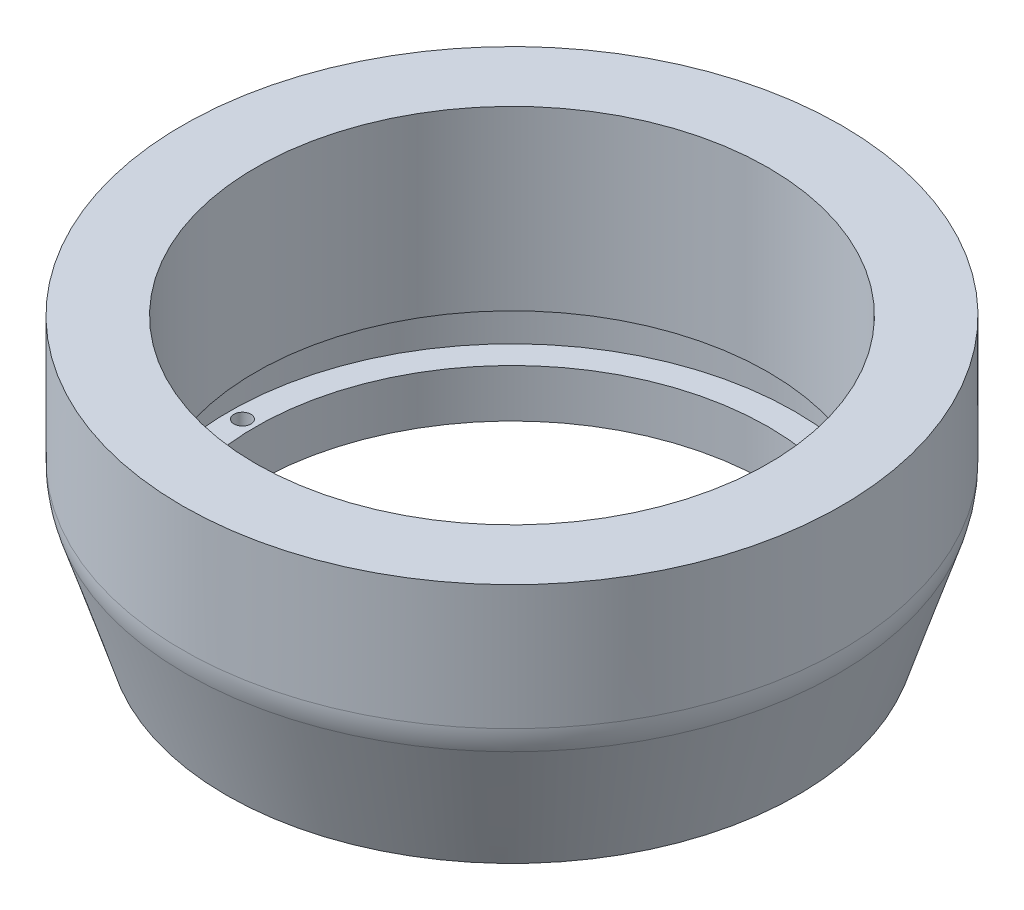
ISO-10303-21;
HEADER;
FILE_DESCRIPTION(('STEP AP214'),'2;1');
FILE_NAME('part.step','',(''),(''),'','','');
FILE_SCHEMA(('AUTOMOTIVE_DESIGN { 1 0 10303 214 1 1 1 1 }'));
ENDSEC;
DATA;
#1=APPLICATION_CONTEXT('core data for automotive mechanical design processes');
#2=APPLICATION_PROTOCOL_DEFINITION('international standard','automotive_design',2000,#1);
#3=PRODUCT_CONTEXT('',#1,'mechanical');
#4=PRODUCT('Part','Part','',(#3));
#5=PRODUCT_RELATED_PRODUCT_CATEGORY('part','',(#4));
#6=PRODUCT_DEFINITION_FORMATION('','',#4);
#7=PRODUCT_DEFINITION_CONTEXT('part definition',#1,'design');
#8=PRODUCT_DEFINITION('design','',#6,#7);
#9=PRODUCT_DEFINITION_SHAPE('','',#8);
#10=(LENGTH_UNIT() NAMED_UNIT(*) SI_UNIT(.MILLI.,.METRE.));
#11=(NAMED_UNIT(*) PLANE_ANGLE_UNIT() SI_UNIT($,.RADIAN.));
#12=(NAMED_UNIT(*) SI_UNIT($,.STERADIAN.) SOLID_ANGLE_UNIT());
#13=UNCERTAINTY_MEASURE_WITH_UNIT(LENGTH_MEASURE(1.E-05),#10,'distance_accuracy_value','');
#14=(GEOMETRIC_REPRESENTATION_CONTEXT(3) GLOBAL_UNCERTAINTY_ASSIGNED_CONTEXT((#13)) GLOBAL_UNIT_ASSIGNED_CONTEXT((#10,
#11,#12)) REPRESENTATION_CONTEXT('',''));
#15=CARTESIAN_POINT('',(0.,0.,0.));
#16=DIRECTION('',(0.,0.,1.));
#17=DIRECTION('',(1.,0.,0.));
#18=AXIS2_PLACEMENT_3D('',#15,#16,#17);
#19=CARTESIAN_POINT('',(0.,37.21,0.));
#20=DIRECTION('',(0.,-1.,0.));
#21=DIRECTION('',(0.,0.,-1.));
#22=AXIS2_PLACEMENT_3D('',#19,#20,#21);
#23=CYLINDRICAL_SURFACE('',#22,35.);
#24=CARTESIAN_POINT('',(0.,6.56708908798464,0.));
#25=DIRECTION('',(0.,1.,0.));
#26=DIRECTION('',(0.,0.,1.));
#27=AXIS2_PLACEMENT_3D('',#24,#25,#26);
#28=CIRCLE('',#27,35.);
#29=CARTESIAN_POINT('',(0.,6.56708908798464,35.));
#30=VERTEX_POINT('',#29);
#31=EDGE_CURVE('E97',#30,#30,#28,.T.);
#32=ORIENTED_EDGE('',*,*,#31,.T.);
#33=EDGE_LOOP('',(#32));
#34=FACE_BOUND('',#33,.T.);
#35=CARTESIAN_POINT('',(0.,0.,0.));
#36=DIRECTION('',(0.,1.,0.));
#37=DIRECTION('',(0.,0.,1.));
#38=AXIS2_PLACEMENT_3D('',#35,#36,#37);
#39=CIRCLE('',#38,35.);
#40=CARTESIAN_POINT('',(0.,0.,35.));
#41=VERTEX_POINT('',#40);
#42=EDGE_CURVE('E105',#41,#41,#39,.T.);
#43=ORIENTED_EDGE('',*,*,#42,.F.);
#44=EDGE_LOOP('',(#43));
#45=FACE_BOUND('',#44,.T.);
#46=ADVANCED_FACE('F47',(#34,#45),#23,.F.);
#47=CARTESIAN_POINT('',(0.,0.,0.));
#48=DIRECTION('',(0.,1.,0.));
#49=DIRECTION('',(0.,0.,1.));
#50=AXIS2_PLACEMENT_3D('',#47,#48,#49);
#51=PLANE('',#50);
#52=CARTESIAN_POINT('',(36.7718018630175,0.,0.));
#53=DIRECTION('',(0.,-1.,0.));
#54=DIRECTION('',(0.,0.,-1.));
#55=AXIS2_PLACEMENT_3D('',#52,#53,#54);
#56=CIRCLE('',#55,1.2222552419214);
#57=CARTESIAN_POINT('',(36.7718018630175,0.,-1.2222552419214));
#58=VERTEX_POINT('',#57);
#59=EDGE_CURVE('E77',#58,#58,#56,.T.);
#60=ORIENTED_EDGE('',*,*,#59,.F.);
#61=EDGE_LOOP('',(#60));
#62=FACE_BOUND('',#61,.T.);
#63=CARTESIAN_POINT('',(-36.8054868900574,0.,0.));
#64=DIRECTION('',(0.,1.,0.));
#65=DIRECTION('',(0.,0.,1.));
#66=AXIS2_PLACEMENT_3D('',#63,#64,#65);
#67=CIRCLE('',#66,1.16193647339322);
#68=CARTESIAN_POINT('',(-36.8054868900574,0.,1.16193647339322));
#69=VERTEX_POINT('',#68);
#70=EDGE_CURVE('E68',#69,#69,#67,.F.);
#71=ORIENTED_EDGE('',*,*,#70,.F.);
#72=EDGE_LOOP('',(#71));
#73=FACE_BOUND('',#72,.T.);
#74=ORIENTED_EDGE('',*,*,#42,.T.);
#75=EDGE_LOOP('',(#74));
#76=FACE_BOUND('',#75,.T.);
#77=CARTESIAN_POINT('',(0.,0.,0.));
#78=DIRECTION('',(0.,1.,0.));
#79=DIRECTION('',(0.,0.,1.));
#80=AXIS2_PLACEMENT_3D('',#77,#78,#79);
#81=CIRCLE('',#80,39.0049481569292);
#82=CARTESIAN_POINT('',(0.,0.,39.0049481569292));
#83=VERTEX_POINT('',#82);
#84=EDGE_CURVE('E101',#83,#83,#81,.T.);
#85=ORIENTED_EDGE('',*,*,#84,.F.);
#86=EDGE_LOOP('',(#85));
#87=FACE_BOUND('',#86,.T.);
#88=ADVANCED_FACE('F121',(#62,#73,#76,#87),#51,.F.);
#89=CARTESIAN_POINT('',(0.,37.21,0.));
#90=DIRECTION('',(0.,-1.,0.));
#91=DIRECTION('',(0.,0.,-1.));
#92=AXIS2_PLACEMENT_3D('',#89,#90,#91);
#93=CYLINDRICAL_SURFACE('',#92,45.);
#94=CARTESIAN_POINT('',(0.,20.176358241834,0.));
#95=DIRECTION('',(0.,-1.,0.));
#96=DIRECTION('',(0.,0.,-1.));
#97=AXIS2_PLACEMENT_3D('',#94,#95,#96);
#98=CIRCLE('',#97,45.);
#99=CARTESIAN_POINT('',(0.,20.176358241834,-45.));
#100=VERTEX_POINT('',#99);
#101=EDGE_CURVE('E56',#100,#100,#98,.F.);
#102=ORIENTED_EDGE('',*,*,#101,.T.);
#103=EDGE_LOOP('',(#102));
#104=FACE_BOUND('',#103,.T.);
#105=CARTESIAN_POINT('',(0.,37.21,0.));
#106=DIRECTION('',(0.,1.,0.));
#107=DIRECTION('',(0.,0.,1.));
#108=AXIS2_PLACEMENT_3D('',#105,#106,#107);
#109=CIRCLE('',#108,45.);
#110=CARTESIAN_POINT('',(0.,37.21,45.));
#111=VERTEX_POINT('',#110);
#112=EDGE_CURVE('E62',#111,#111,#109,.T.);
#113=ORIENTED_EDGE('',*,*,#112,.F.);
#114=EDGE_LOOP('',(#113));
#115=FACE_BOUND('',#114,.T.);
#116=ADVANCED_FACE('F119',(#104,#115),#93,.T.);
#117=CARTESIAN_POINT('',(0.,37.21,0.));
#118=DIRECTION('',(0.,1.,0.));
#119=DIRECTION('',(0.,0.,1.));
#120=AXIS2_PLACEMENT_3D('',#117,#118,#119);
#121=PLANE('',#120);
#122=ORIENTED_EDGE('',*,*,#112,.T.);
#123=EDGE_LOOP('',(#122));
#124=FACE_BOUND('',#123,.T.);
#125=CARTESIAN_POINT('',(0.,37.21,0.));
#126=DIRECTION('',(0.,1.,0.));
#127=DIRECTION('',(0.,0.,1.));
#128=AXIS2_PLACEMENT_3D('',#125,#126,#127);
#129=CIRCLE('',#128,35.);
#130=CARTESIAN_POINT('',(0.,37.21,35.));
#131=VERTEX_POINT('',#130);
#132=EDGE_CURVE('E106',#131,#131,#129,.T.);
#133=ORIENTED_EDGE('',*,*,#132,.F.);
#134=EDGE_LOOP('',(#133));
#135=FACE_BOUND('',#134,.T.);
#136=ADVANCED_FACE('F116',(#124,#135),#121,.T.);
#137=CARTESIAN_POINT('',(0.,13.0326808145753,0.));
#138=DIRECTION('',(0.,1.,0.));
#139=DIRECTION('',(0.,0.,1.));
#140=AXIS2_PLACEMENT_3D('',#137,#138,#139);
#141=CIRCLE('',#140,35.);
#142=CARTESIAN_POINT('',(0.,13.0326808145753,35.));
#143=VERTEX_POINT('',#142);
#144=EDGE_CURVE('E74',#143,#143,#141,.T.);
#145=ORIENTED_EDGE('',*,*,#144,.F.);
#146=EDGE_LOOP('',(#145));
#147=FACE_BOUND('',#146,.T.);
#148=ORIENTED_EDGE('',*,*,#132,.T.);
#149=EDGE_LOOP('',(#148));
#150=FACE_BOUND('',#149,.T.);
#151=ADVANCED_FACE('F127',(#147,#150),#23,.F.);
#152=CARTESIAN_POINT('',(0.,18.605,0.));
#153=DIRECTION('',(0.,1.,0.));
#154=DIRECTION('',(0.,0.,1.));
#155=AXIS2_PLACEMENT_3D('',#152,#153,#154);
#156=CONICAL_SURFACE('',#155,45.,0.311722675834485);
#157=CARTESIAN_POINT('',(0.,17.109370791719,0.));
#158=DIRECTION('',(0.,1.,0.));
#159=DIRECTION('',(0.,0.,1.));
#160=AXIS2_PLACEMENT_3D('',#157,#158,#159);
#161=CIRCLE('',#160,44.518066399266);
#162=CARTESIAN_POINT('',(0.,17.109370791719,44.518066399266));
#163=VERTEX_POINT('',#162);
#164=EDGE_CURVE('E10',#163,#163,#161,.F.);
#165=ORIENTED_EDGE('',*,*,#164,.T.);
#166=EDGE_LOOP('',(#165));
#167=FACE_BOUND('',#166,.T.);
#168=ORIENTED_EDGE('',*,*,#84,.T.);
#169=EDGE_LOOP('',(#168));
#170=FACE_BOUND('',#169,.T.);
#171=ADVANCED_FACE('F141',(#167,#170),#156,.T.);
#172=CARTESIAN_POINT('',(0.,20.176358241834,0.));
#173=DIRECTION('',(0.,-1.,0.));
#174=DIRECTION('',(0.,0.,-1.));
#175=AXIS2_PLACEMENT_3D('',#172,#173,#174);
#176=TOROIDAL_SURFACE('',#175,35.,10.);
#177=ORIENTED_EDGE('',*,*,#164,.F.);
#178=EDGE_LOOP('',(#177));
#179=FACE_BOUND('',#178,.T.);
#180=ORIENTED_EDGE('',*,*,#101,.F.);
#181=EDGE_LOOP('',(#180));
#182=FACE_BOUND('',#181,.T.);
#183=ADVANCED_FACE('F49',(#179,#182),#176,.T.);
#184=CARTESIAN_POINT('',(0.,6.56708908798464,35.));
#185=DIRECTION('',(0.,-1.,0.));
#186=DIRECTION('',(0.,0.,-1.));
#187=AXIS2_PLACEMENT_3D('',#184,#185,#186);
#188=PLANE('',#187);
#189=CARTESIAN_POINT('',(36.7718018630175,6.56708908798464,0.));
#190=DIRECTION('',(0.,-1.,0.));
#191=DIRECTION('',(0.,0.,-1.));
#192=AXIS2_PLACEMENT_3D('',#189,#190,#191);
#193=CIRCLE('',#192,1.2222552419214);
#194=CARTESIAN_POINT('',(36.7718018630175,6.56708908798464,-1.2222552419214));
#195=VERTEX_POINT('',#194);
#196=EDGE_CURVE('E51',#195,#195,#193,.T.);
#197=ORIENTED_EDGE('',*,*,#196,.T.);
#198=EDGE_LOOP('',(#197));
#199=FACE_BOUND('',#198,.T.);
#200=CARTESIAN_POINT('',(-36.8054868900574,6.56708908798464,0.));
#201=DIRECTION('',(0.,-1.,0.));
#202=DIRECTION('',(0.,0.,-1.));
#203=AXIS2_PLACEMENT_3D('',#200,#201,#202);
#204=CIRCLE('',#203,1.16193647339322);
#205=CARTESIAN_POINT('',(-36.8054868900574,6.56708908798464,1.16193647339322));
#206=VERTEX_POINT('',#205);
#207=EDGE_CURVE('E65',#206,#206,#204,.F.);
#208=ORIENTED_EDGE('',*,*,#207,.F.);
#209=EDGE_LOOP('',(#208));
#210=FACE_BOUND('',#209,.T.);
#211=ORIENTED_EDGE('',*,*,#31,.F.);
#212=EDGE_LOOP('',(#211));
#213=FACE_BOUND('',#212,.T.);
#214=CARTESIAN_POINT('',(0.,6.56708908798464,0.));
#215=DIRECTION('',(0.,1.,0.));
#216=DIRECTION('',(0.,0.,1.));
#217=AXIS2_PLACEMENT_3D('',#214,#215,#216);
#218=CIRCLE('',#217,38.6234032088691);
#219=CARTESIAN_POINT('',(0.,6.56708908798464,38.6234032088691));
#220=VERTEX_POINT('',#219);
#221=EDGE_CURVE('E93',#220,#220,#218,.T.);
#222=ORIENTED_EDGE('',*,*,#221,.T.);
#223=EDGE_LOOP('',(#222));
#224=FACE_BOUND('',#223,.T.);
#225=ADVANCED_FACE('F161',(#199,#210,#213,#224),#188,.F.);
#226=CARTESIAN_POINT('',(0.,37.21,0.));
#227=DIRECTION('',(0.,1.,0.));
#228=DIRECTION('',(0.,0.,1.));
#229=AXIS2_PLACEMENT_3D('',#226,#227,#228);
#230=CYLINDRICAL_SURFACE('',#229,38.6234032088691);
#231=ORIENTED_EDGE('',*,*,#221,.F.);
#232=EDGE_LOOP('',(#231));
#233=FACE_BOUND('',#232,.T.);
#234=CARTESIAN_POINT('',(0.,13.0326808145753,0.));
#235=DIRECTION('',(0.,1.,0.));
#236=DIRECTION('',(0.,0.,1.));
#237=AXIS2_PLACEMENT_3D('',#234,#235,#236);
#238=CIRCLE('',#237,38.6234032088691);
#239=CARTESIAN_POINT('',(0.,13.0326808145753,38.6234032088691));
#240=VERTEX_POINT('',#239);
#241=EDGE_CURVE('E89',#240,#240,#238,.T.);
#242=ORIENTED_EDGE('',*,*,#241,.T.);
#243=EDGE_LOOP('',(#242));
#244=FACE_BOUND('',#243,.T.);
#245=ADVANCED_FACE('F153',(#233,#244),#230,.F.);
#246=CARTESIAN_POINT('',(0.,13.0326808145753,35.));
#247=DIRECTION('',(0.,1.,0.));
#248=DIRECTION('',(0.,0.,1.));
#249=AXIS2_PLACEMENT_3D('',#246,#247,#248);
#250=PLANE('',#249);
#251=ORIENTED_EDGE('',*,*,#241,.F.);
#252=EDGE_LOOP('',(#251));
#253=FACE_BOUND('',#252,.T.);
#254=ORIENTED_EDGE('',*,*,#144,.T.);
#255=EDGE_LOOP('',(#254));
#256=FACE_BOUND('',#255,.T.);
#257=ADVANCED_FACE('F150',(#253,#256),#250,.F.);
#258=CARTESIAN_POINT('',(-36.8054868900574,-1.2E-05,0.));
#259=DIRECTION('',(0.,1.,0.));
#260=DIRECTION('',(0.,0.,1.));
#261=AXIS2_PLACEMENT_3D('',#258,#259,#260);
#262=CYLINDRICAL_SURFACE('',#261,1.16193647339322);
#263=CARTESIAN_POINT('',(-36.8054868900574,6.56708908798464,1.16193647339322));
#264=CARTESIAN_POINT('',(-36.8054868900574,6.4986819099848,1.16193647339322));
#265=CARTESIAN_POINT('',(-36.8054868900574,6.43027473198496,1.16193647339322));
#266=CARTESIAN_POINT('',(-36.8054868900574,6.29346037598528,1.16193647339322));
#267=CARTESIAN_POINT('',(-36.8054868900574,6.22505319798544,1.16193647339322));
#268=CARTESIAN_POINT('',(-36.8054868900574,6.08823884198576,1.16193647339322));
#269=CARTESIAN_POINT('',(-36.8054868900574,6.01983166398592,1.16193647339322));
#270=CARTESIAN_POINT('',(-36.8054868900574,5.88301730798624,1.16193647339322));
#271=CARTESIAN_POINT('',(-36.8054868900574,5.8146101299864,1.16193647339322));
#272=CARTESIAN_POINT('',(-36.8054868900574,5.67779577398672,1.16193647339322));
#273=CARTESIAN_POINT('',(-36.8054868900574,5.60938859598688,1.16193647339322));
#274=CARTESIAN_POINT('',(-36.8054868900574,5.4725742399872,1.16193647339322));
#275=CARTESIAN_POINT('',(-36.8054868900574,5.40416706198736,1.16193647339322));
#276=CARTESIAN_POINT('',(-36.8054868900574,5.26735270598768,1.16193647339322));
#277=CARTESIAN_POINT('',(-36.8054868900574,5.19894552798784,1.16193647339322));
#278=CARTESIAN_POINT('',(-36.8054868900574,5.06213117198816,1.16193647339322));
#279=CARTESIAN_POINT('',(-36.8054868900574,4.99372399398832,1.16193647339322));
#280=CARTESIAN_POINT('',(-36.8054868900574,4.85690963798864,1.16193647339322));
#281=CARTESIAN_POINT('',(-36.8054868900574,4.7885024599888,1.16193647339322));
#282=CARTESIAN_POINT('',(-36.8054868900574,4.65168810398912,1.16193647339322));
#283=CARTESIAN_POINT('',(-36.8054868900574,4.58328092598928,1.16193647339322));
#284=CARTESIAN_POINT('',(-36.8054868900574,4.4464665699896,1.16193647339322));
#285=CARTESIAN_POINT('',(-36.8054868900574,4.37805939198976,1.16193647339322));
#286=CARTESIAN_POINT('',(-36.8054868900574,4.24124503599008,1.16193647339322));
#287=CARTESIAN_POINT('',(-36.8054868900574,4.17283785799024,1.16193647339322));
#288=CARTESIAN_POINT('',(-36.8054868900574,4.03602350199056,1.16193647339322));
#289=CARTESIAN_POINT('',(-36.8054868900574,3.96761632399072,1.16193647339322));
#290=CARTESIAN_POINT('',(-36.8054868900574,3.83080196799104,1.16193647339322));
#291=CARTESIAN_POINT('',(-36.8054868900574,3.7623947899912,1.16193647339322));
#292=CARTESIAN_POINT('',(-36.8054868900574,3.62558043399152,1.16193647339322));
#293=CARTESIAN_POINT('',(-36.8054868900574,3.55717325599168,1.16193647339322));
#294=CARTESIAN_POINT('',(-36.8054868900574,3.420358899992,1.16193647339322));
#295=CARTESIAN_POINT('',(-36.8054868900574,3.35195172199216,1.16193647339322));
#296=CARTESIAN_POINT('',(-36.8054868900574,3.21513736599248,1.16193647339322));
#297=CARTESIAN_POINT('',(-36.8054868900574,3.14673018799264,1.16193647339322));
#298=CARTESIAN_POINT('',(-36.8054868900574,3.00991583199296,1.16193647339322));
#299=CARTESIAN_POINT('',(-36.8054868900574,2.94150865399312,1.16193647339322));
#300=CARTESIAN_POINT('',(-36.8054868900574,2.80469429799344,1.16193647339322));
#301=CARTESIAN_POINT('',(-36.8054868900574,2.7362871199936,1.16193647339322));
#302=CARTESIAN_POINT('',(-36.8054868900574,2.59947276399392,1.16193647339322));
#303=CARTESIAN_POINT('',(-36.8054868900574,2.53106558599408,1.16193647339322));
#304=CARTESIAN_POINT('',(-36.8054868900574,2.3942512299944,1.16193647339322));
#305=CARTESIAN_POINT('',(-36.8054868900574,2.32584405199456,1.16193647339322));
#306=CARTESIAN_POINT('',(-36.8054868900574,2.18902969599488,1.16193647339322));
#307=CARTESIAN_POINT('',(-36.8054868900574,2.12062251799504,1.16193647339322));
#308=CARTESIAN_POINT('',(-36.8054868900574,1.98380816199536,1.16193647339322));
#309=CARTESIAN_POINT('',(-36.8054868900574,1.91540098399552,1.16193647339322));
#310=CARTESIAN_POINT('',(-36.8054868900574,1.77858662799584,1.16193647339322));
#311=CARTESIAN_POINT('',(-36.8054868900574,1.710179449996,1.16193647339322));
#312=CARTESIAN_POINT('',(-36.8054868900574,1.57336509399632,1.16193647339322));
#313=CARTESIAN_POINT('',(-36.8054868900574,1.50495791599648,1.16193647339322));
#314=CARTESIAN_POINT('',(-36.8054868900574,1.3681435599968,1.16193647339322));
#315=CARTESIAN_POINT('',(-36.8054868900574,1.29973638199696,1.16193647339322));
#316=CARTESIAN_POINT('',(-36.8054868900574,1.16292202599728,1.16193647339322));
#317=CARTESIAN_POINT('',(-36.8054868900574,1.09451484799744,1.16193647339322));
#318=CARTESIAN_POINT('',(-36.8054868900574,0.95770049199776,1.16193647339322));
#319=CARTESIAN_POINT('',(-36.8054868900574,0.889293313997919,1.16193647339322));
#320=CARTESIAN_POINT('',(-36.8054868900574,0.752478957998239,1.16193647339322));
#321=CARTESIAN_POINT('',(-36.8054868900574,0.684071779998399,1.16193647339322));
#322=CARTESIAN_POINT('',(-36.8054868900574,0.54725742399872,1.16193647339322));
#323=CARTESIAN_POINT('',(-36.8054868900574,0.47885024599888,1.16193647339322));
#324=CARTESIAN_POINT('',(-36.8054868900574,0.3420358899992,1.16193647339322));
#325=CARTESIAN_POINT('',(-36.8054868900574,0.27362871199936,1.16193647339322));
#326=CARTESIAN_POINT('',(-36.8054868900574,0.13681435599968,1.16193647339322));
#327=CARTESIAN_POINT('',(-36.8054868900574,0.0684071779998399,1.16193647339322));
#328=CARTESIAN_POINT('',(-36.8054868900574,0.,1.16193647339322));
#329=B_SPLINE_CURVE_WITH_KNOTS('',3,(#263,#264,#265,#266,#267,#268,#269,#270,#271,#272,#273,
#274,#275,#276,#277,#278,#279,#280,#281,#282,#283,#284,#285,#286,#287,#288,#289,#290,#291,#292,
#293,#294,#295,#296,#297,#298,#299,#300,#301,#302,#303,#304,#305,#306,#307,#308,#309,#310,#311,
#312,#313,#314,#315,#316,#317,#318,#319,#320,#321,#322,#323,#324,#325,#326,#327,#328),
.UNSPECIFIED.,.F.,.F.,(4,2,2,2,2,2,2,2,2,2,2,2,2,2,2,2,2,2,2,2,2,2,2,2,2,2,2,2,2,2,2,2,4),(0.,
0.20522153399952,0.41044306799904,0.61566460199856,0.82088613599808,1.0261076699976,
1.23132920399712,1.43655073799664,1.64177227199616,1.84699380599568,2.0522153399952,
2.25743687399472,2.46265840799424,2.66787994199376,2.87310147599328,3.0783230099928,
3.28354454399232,3.48876607799184,3.69398761199136,3.89920914599088,4.1044306799904,
4.30965221398992,4.51487374798944,4.72009528198896,4.92531681598848,5.130538349988,
5.33575988398752,5.54098141798704,5.74620295198656,5.95142448598608,6.1566460199856,
6.36186755398512,6.56708908798464),.UNSPECIFIED.);
#330=EDGE_CURVE('BSEAM152',#206,#69,#329,.T.);
#331=ORIENTED_EDGE('',*,*,#207,.T.);
#332=ORIENTED_EDGE('',*,*,#70,.T.);
#333=ORIENTED_EDGE('',*,*,#330,.T.);
#334=ORIENTED_EDGE('',*,*,#330,.F.);
#335=EDGE_LOOP('',(#331,#333,#332,#334));
#336=FACE_BOUND('',#335,.T.);
#337=ADVANCED_FACE('F152',(#336),#262,.F.);
#338=CARTESIAN_POINT('',(36.7718018630175,10.,0.));
#339=DIRECTION('',(0.,-1.,0.));
#340=DIRECTION('',(0.,0.,-1.));
#341=AXIS2_PLACEMENT_3D('',#338,#339,#340);
#342=CYLINDRICAL_SURFACE('',#341,1.2222552419214);
#343=ORIENTED_EDGE('',*,*,#59,.T.);
#344=EDGE_LOOP('',(#343));
#345=FACE_BOUND('',#344,.T.);
#346=ORIENTED_EDGE('',*,*,#196,.F.);
#347=EDGE_LOOP('',(#346));
#348=FACE_BOUND('',#347,.T.);
#349=ADVANCED_FACE('F159',(#345,#348),#342,.F.);
#350=CLOSED_SHELL('',(#46,#88,#116,#136,#151,#171,#183,#225,#245,#257,#337,#349));
#351=MANIFOLD_SOLID_BREP('B2',#350);
#352=ADVANCED_BREP_SHAPE_REPRESENTATION('',(#18,#351),#14);
#353=SHAPE_DEFINITION_REPRESENTATION(#9,#352);
ENDSEC;
END-ISO-10303-21;
